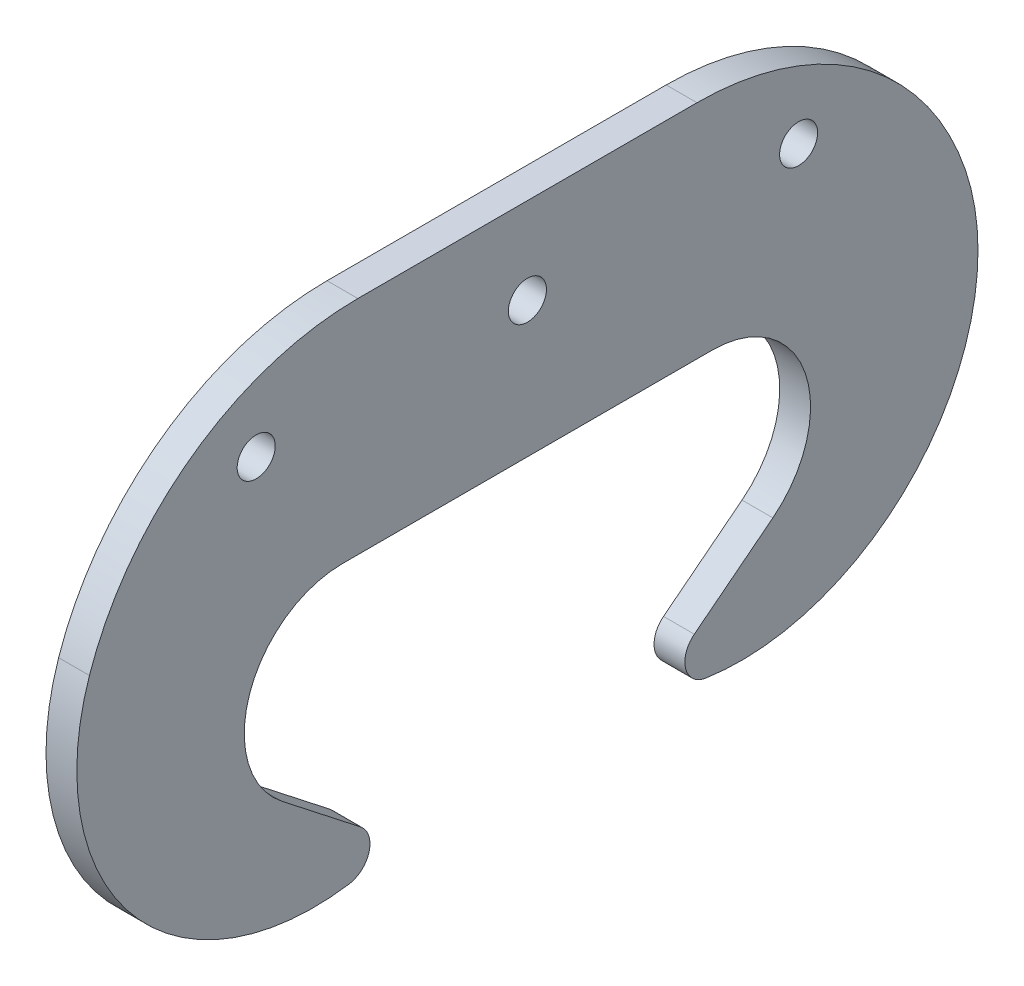
ISO-10303-21;
HEADER;
FILE_DESCRIPTION(('STEP AP214'),'2;1');
FILE_NAME('part.step','',(''),(''),'','','');
FILE_SCHEMA(('AUTOMOTIVE_DESIGN { 1 0 10303 214 1 1 1 1 }'));
ENDSEC;
DATA;
#1=APPLICATION_CONTEXT('core data for automotive mechanical design processes');
#2=APPLICATION_PROTOCOL_DEFINITION('international standard','automotive_design',2000,#1);
#3=PRODUCT_CONTEXT('',#1,'mechanical');
#4=PRODUCT('Part','Part','',(#3));
#5=PRODUCT_RELATED_PRODUCT_CATEGORY('part','',(#4));
#6=PRODUCT_DEFINITION_FORMATION('','',#4);
#7=PRODUCT_DEFINITION_CONTEXT('part definition',#1,'design');
#8=PRODUCT_DEFINITION('design','',#6,#7);
#9=PRODUCT_DEFINITION_SHAPE('','',#8);
#10=(LENGTH_UNIT() NAMED_UNIT(*) SI_UNIT(.MILLI.,.METRE.));
#11=(NAMED_UNIT(*) PLANE_ANGLE_UNIT() SI_UNIT($,.RADIAN.));
#12=(NAMED_UNIT(*) SI_UNIT($,.STERADIAN.) SOLID_ANGLE_UNIT());
#13=UNCERTAINTY_MEASURE_WITH_UNIT(LENGTH_MEASURE(1.E-05),#10,'distance_accuracy_value','');
#14=(GEOMETRIC_REPRESENTATION_CONTEXT(3) GLOBAL_UNCERTAINTY_ASSIGNED_CONTEXT((#13)) GLOBAL_UNIT_ASSIGNED_CONTEXT((#10,
#11,#12)) REPRESENTATION_CONTEXT('',''));
#15=CARTESIAN_POINT('',(0.,0.,0.));
#16=DIRECTION('',(0.,0.,1.));
#17=DIRECTION('',(1.,0.,0.));
#18=AXIS2_PLACEMENT_3D('',#15,#16,#17);
#19=CARTESIAN_POINT('',(7.9375,0.,0.));
#20=DIRECTION('',(1.,0.,0.));
#21=DIRECTION('',(0.,0.,-1.));
#22=AXIS2_PLACEMENT_3D('',#19,#20,#21);
#23=PLANE('',#22);
#24=CARTESIAN_POINT('',(7.9375,30.1625,69.85));
#25=DIRECTION('',(1.,0.,0.));
#26=DIRECTION('',(0.,0.,-1.));
#27=AXIS2_PLACEMENT_3D('',#24,#25,#26);
#28=CIRCLE('',#27,4.90219999999997);
#29=CARTESIAN_POINT('',(7.9375,30.1625,64.9478));
#30=VERTEX_POINT('',#29);
#31=EDGE_CURVE('E212',#30,#30,#28,.T.);
#32=ORIENTED_EDGE('',*,*,#31,.F.);
#33=EDGE_LOOP('',(#32));
#34=FACE_BOUND('',#33,.T.);
#35=CARTESIAN_POINT('',(7.9375,30.1625,0.));
#36=DIRECTION('',(1.,0.,0.));
#37=DIRECTION('',(0.,0.,-1.));
#38=AXIS2_PLACEMENT_3D('',#35,#36,#37);
#39=CIRCLE('',#38,4.90219999999997);
#40=CARTESIAN_POINT('',(7.9375,30.1625,-4.90219999999997));
#41=VERTEX_POINT('',#40);
#42=EDGE_CURVE('E226',#41,#41,#39,.T.);
#43=ORIENTED_EDGE('',*,*,#42,.F.);
#44=EDGE_LOOP('',(#43));
#45=FACE_BOUND('',#44,.T.);
#46=CARTESIAN_POINT('',(7.9375,30.1625,-69.85));
#47=DIRECTION('',(1.,0.,0.));
#48=DIRECTION('',(0.,0.,-1.));
#49=AXIS2_PLACEMENT_3D('',#46,#47,#48);
#50=CIRCLE('',#49,4.90219999999997);
#51=CARTESIAN_POINT('',(7.9375,30.1625,-74.7522));
#52=VERTEX_POINT('',#51);
#53=EDGE_CURVE('E232',#52,#52,#50,.T.);
#54=ORIENTED_EDGE('',*,*,#53,.F.);
#55=EDGE_LOOP('',(#54));
#56=FACE_BOUND('',#55,.T.);
#57=CARTESIAN_POINT('',(7.9375,-16.7692967759258,55.0441756714041));
#58=DIRECTION('',(1.,0.,0.));
#59=DIRECTION('',(0.,0.,-1.));
#60=AXIS2_PLACEMENT_3D('',#57,#58,#59);
#61=CIRCLE('',#60,61.0094261497217);
#62=CARTESIAN_POINT('',(7.9375,2.87161774650495,112.805620908179));
#63=VERTEX_POINT('',#62);
#64=CARTESIAN_POINT('',(7.9375,-77.0978506977302,45.9548599203538));
#65=VERTEX_POINT('',#64);
#66=EDGE_CURVE('E194',#63,#65,#61,.T.);
#67=ORIENTED_EDGE('',*,*,#66,.T.);
#68=CARTESIAN_POINT('',(7.9375,-70.8187174296458,46.9008966012681));
#69=DIRECTION('',(1.,0.,0.));
#70=DIRECTION('',(0.,0.,-1.));
#71=AXIS2_PLACEMENT_3D('',#68,#69,#70);
#72=CIRCLE('',#71,6.35);
#73=CARTESIAN_POINT('',(7.9375,-65.8180606732476,42.9873391397391));
#74=VERTEX_POINT('',#73);
#75=EDGE_CURVE('E275',#65,#74,#72,.T.);
#76=ORIENTED_EDGE('',*,*,#75,.T.);
#77=DIRECTION('',(0.,-0.616308261658114,-0.787505001007583));
#78=VECTOR('',#77,1.);
#79=CARTESIAN_POINT('',(7.9375,-61.6817262602576,48.2726553341151));
#80=LINE('',#79,#78);
#81=CARTESIAN_POINT('',(7.9375,-49.9858306665572,63.2174108149545));
#82=VERTEX_POINT('',#81);
#83=EDGE_CURVE('E239',#82,#74,#80,.T.);
#84=ORIENTED_EDGE('',*,*,#83,.F.);
#85=CARTESIAN_POINT('',(7.9375,-30.0621946252266,47.625));
#86=DIRECTION('',(1.,0.,0.));
#87=DIRECTION('',(0.,0.,1.));
#88=AXIS2_PLACEMENT_3D('',#85,#86,#87);
#89=CIRCLE('',#88,25.2996946252266);
#90=CARTESIAN_POINT('',(7.9375,-4.76250000000002,47.625));
#91=VERTEX_POINT('',#90);
#92=EDGE_CURVE('E203',#91,#82,#89,.T.);
#93=ORIENTED_EDGE('',*,*,#92,.F.);
#94=DIRECTION('',(0.,0.,-1.));
#95=VECTOR('',#94,1.);
#96=CARTESIAN_POINT('',(7.9375,-4.76250000000002,0.));
#97=LINE('',#96,#95);
#98=CARTESIAN_POINT('',(7.9375,-4.76250000000001,-47.625));
#99=VERTEX_POINT('',#98);
#100=EDGE_CURVE('E242',#91,#99,#97,.T.);
#101=ORIENTED_EDGE('',*,*,#100,.T.);
#102=CARTESIAN_POINT('',(7.9375,-30.0621946252266,-47.625));
#103=DIRECTION('',(1.,0.,0.));
#104=DIRECTION('',(0.,0.,-1.));
#105=AXIS2_PLACEMENT_3D('',#102,#103,#104);
#106=CIRCLE('',#105,25.2996946252265);
#107=CARTESIAN_POINT('',(7.9375,-49.9858306665571,-63.2174108149545));
#108=VERTEX_POINT('',#107);
#109=EDGE_CURVE('E215',#108,#99,#106,.T.);
#110=ORIENTED_EDGE('',*,*,#109,.F.);
#111=DIRECTION('',(0.,0.616308261658111,-0.787505001007585));
#112=VECTOR('',#111,1.);
#113=CARTESIAN_POINT('',(7.9375,-61.6817262602579,-48.2726553341149));
#114=LINE('',#113,#112);
#115=CARTESIAN_POINT('',(7.9375,-65.8180606732476,-42.9873391397392));
#116=VERTEX_POINT('',#115);
#117=EDGE_CURVE('E149',#116,#108,#114,.T.);
#118=ORIENTED_EDGE('',*,*,#117,.F.);
#119=CARTESIAN_POINT('',(7.9375,-70.8187174296458,-46.9008966012681));
#120=DIRECTION('',(1.,0.,0.));
#121=DIRECTION('',(0.,0.,-1.));
#122=AXIS2_PLACEMENT_3D('',#119,#120,#121);
#123=CIRCLE('',#122,6.35);
#124=CARTESIAN_POINT('',(7.9375,-77.0978506977302,-45.9548599203538));
#125=VERTEX_POINT('',#124);
#126=EDGE_CURVE('E64',#116,#125,#123,.T.);
#127=ORIENTED_EDGE('',*,*,#126,.T.);
#128=CARTESIAN_POINT('',(7.9375,-16.7692967759258,-55.0441756714041));
#129=DIRECTION('',(1.,0.,0.));
#130=DIRECTION('',(0.,0.,-1.));
#131=AXIS2_PLACEMENT_3D('',#128,#129,#130);
#132=CIRCLE('',#131,61.0094261497217);
#133=CARTESIAN_POINT('',(7.9375,2.87161774650496,-112.805620908179));
#134=VERTEX_POINT('',#133);
#135=EDGE_CURVE('E173',#125,#134,#132,.T.);
#136=ORIENTED_EDGE('',*,*,#135,.T.);
#137=CARTESIAN_POINT('',(7.9375,-20.6375,-43.668279277328));
#138=DIRECTION('',(1.,0.,0.));
#139=DIRECTION('',(0.,0.,-1.));
#140=AXIS2_PLACEMENT_3D('',#137,#138,#139);
#141=CIRCLE('',#140,73.0250000000001);
#142=CARTESIAN_POINT('',(7.93749999999996,52.3875,-43.668279277328));
#143=VERTEX_POINT('',#142);
#144=EDGE_CURVE('E185',#134,#143,#141,.T.);
#145=ORIENTED_EDGE('',*,*,#144,.T.);
#146=DIRECTION('',(0.,0.,-1.));
#147=VECTOR('',#146,1.);
#148=CARTESIAN_POINT('',(7.93749999999993,52.3875,-43.668279277328));
#149=LINE('',#148,#147);
#150=CARTESIAN_POINT('',(7.9375,52.3875,43.668279277328));
#151=VERTEX_POINT('',#150);
#152=EDGE_CURVE('E171',#151,#143,#149,.T.);
#153=ORIENTED_EDGE('',*,*,#152,.F.);
#154=CARTESIAN_POINT('',(7.9375,-20.6375,43.668279277328));
#155=DIRECTION('',(1.,0.,0.));
#156=DIRECTION('',(0.,0.,-1.));
#157=AXIS2_PLACEMENT_3D('',#154,#155,#156);
#158=CIRCLE('',#157,73.0250000000001);
#159=EDGE_CURVE('E157',#151,#63,#158,.T.);
#160=ORIENTED_EDGE('',*,*,#159,.T.);
#161=EDGE_LOOP('',(#67,#76,#84,#93,#101,#110,#118,#127,#136,#145,#153,#160));
#162=FACE_BOUND('',#161,.T.);
#163=ADVANCED_FACE('F49',(#34,#45,#56,#162),#23,.T.);
#164=CARTESIAN_POINT('',(0.,0.,0.));
#165=DIRECTION('',(1.,0.,0.));
#166=DIRECTION('',(0.,0.,-1.));
#167=AXIS2_PLACEMENT_3D('',#164,#165,#166);
#168=PLANE('',#167);
#169=CARTESIAN_POINT('',(0.,30.1625,69.85));
#170=DIRECTION('',(1.,0.,0.));
#171=DIRECTION('',(0.,0.,-1.));
#172=AXIS2_PLACEMENT_3D('',#169,#170,#171);
#173=CIRCLE('',#172,4.9022);
#174=CARTESIAN_POINT('',(0.,30.1625,64.9478));
#175=VERTEX_POINT('',#174);
#176=EDGE_CURVE('E223',#175,#175,#173,.T.);
#177=ORIENTED_EDGE('',*,*,#176,.T.);
#178=EDGE_LOOP('',(#177));
#179=FACE_BOUND('',#178,.T.);
#180=CARTESIAN_POINT('',(0.,30.1625,0.));
#181=DIRECTION('',(1.,0.,0.));
#182=DIRECTION('',(0.,0.,-1.));
#183=AXIS2_PLACEMENT_3D('',#180,#181,#182);
#184=CIRCLE('',#183,4.9022);
#185=CARTESIAN_POINT('',(0.,30.1625,-4.9022));
#186=VERTEX_POINT('',#185);
#187=EDGE_CURVE('E229',#186,#186,#184,.T.);
#188=ORIENTED_EDGE('',*,*,#187,.T.);
#189=EDGE_LOOP('',(#188));
#190=FACE_BOUND('',#189,.T.);
#191=CARTESIAN_POINT('',(0.,30.1625,-69.85));
#192=DIRECTION('',(1.,0.,0.));
#193=DIRECTION('',(0.,0.,-1.));
#194=AXIS2_PLACEMENT_3D('',#191,#192,#193);
#195=CIRCLE('',#194,4.9022);
#196=CARTESIAN_POINT('',(0.,30.1625,-74.7522));
#197=VERTEX_POINT('',#196);
#198=EDGE_CURVE('E235',#197,#197,#195,.T.);
#199=ORIENTED_EDGE('',*,*,#198,.T.);
#200=EDGE_LOOP('',(#199));
#201=FACE_BOUND('',#200,.T.);
#202=DIRECTION('',(0.,-0.616308261658114,-0.787505001007583));
#203=VECTOR('',#202,1.);
#204=CARTESIAN_POINT('',(0.,-61.6817262602576,48.2726553341151));
#205=LINE('',#204,#203);
#206=CARTESIAN_POINT('',(0.,-49.9858306665572,63.2174108149545));
#207=VERTEX_POINT('',#206);
#208=CARTESIAN_POINT('',(0.,-65.8180606732476,42.9873391397391));
#209=VERTEX_POINT('',#208);
#210=EDGE_CURVE('E238',#207,#209,#205,.T.);
#211=ORIENTED_EDGE('',*,*,#210,.T.);
#212=CARTESIAN_POINT('',(0.,-70.8187174296458,46.9008966012681));
#213=DIRECTION('',(1.,0.,0.));
#214=DIRECTION('',(0.,0.,-1.));
#215=AXIS2_PLACEMENT_3D('',#212,#213,#214);
#216=CIRCLE('',#215,6.35);
#217=CARTESIAN_POINT('',(0.,-77.0978506977302,45.9548599203538));
#218=VERTEX_POINT('',#217);
#219=EDGE_CURVE('E179',#209,#218,#216,.F.);
#220=ORIENTED_EDGE('',*,*,#219,.T.);
#221=CARTESIAN_POINT('',(0.,-16.7692967759258,55.0441756714041));
#222=DIRECTION('',(1.,0.,0.));
#223=DIRECTION('',(0.,0.,-1.));
#224=AXIS2_PLACEMENT_3D('',#221,#222,#223);
#225=CIRCLE('',#224,61.0094261497217);
#226=CARTESIAN_POINT('',(0.,2.87161774650495,112.805620908179));
#227=VERTEX_POINT('',#226);
#228=EDGE_CURVE('E163',#227,#218,#225,.T.);
#229=ORIENTED_EDGE('',*,*,#228,.F.);
#230=CARTESIAN_POINT('',(0.,-20.6375,43.668279277328));
#231=DIRECTION('',(1.,0.,0.));
#232=DIRECTION('',(0.,0.,-1.));
#233=AXIS2_PLACEMENT_3D('',#230,#231,#232);
#234=CIRCLE('',#233,73.0250000000001);
#235=CARTESIAN_POINT('',(0.,52.3875,43.668279277328));
#236=VERTEX_POINT('',#235);
#237=EDGE_CURVE('E154',#236,#227,#234,.T.);
#238=ORIENTED_EDGE('',*,*,#237,.F.);
#239=DIRECTION('',(0.,0.,-1.));
#240=VECTOR('',#239,1.);
#241=CARTESIAN_POINT('',(0.,52.3875,0.));
#242=LINE('',#241,#240);
#243=CARTESIAN_POINT('',(0.,52.3875,-43.668279277328));
#244=VERTEX_POINT('',#243);
#245=EDGE_CURVE('E137',#236,#244,#242,.T.);
#246=ORIENTED_EDGE('',*,*,#245,.T.);
#247=CARTESIAN_POINT('',(0.,-20.6375,-43.668279277328));
#248=DIRECTION('',(1.,0.,0.));
#249=DIRECTION('',(0.,0.,-1.));
#250=AXIS2_PLACEMENT_3D('',#247,#248,#249);
#251=CIRCLE('',#250,73.0250000000001);
#252=CARTESIAN_POINT('',(0.,2.87161774650496,-112.805620908179));
#253=VERTEX_POINT('',#252);
#254=EDGE_CURVE('E148',#253,#244,#251,.T.);
#255=ORIENTED_EDGE('',*,*,#254,.F.);
#256=CARTESIAN_POINT('',(0.,-16.7692967759258,-55.0441756714041));
#257=DIRECTION('',(1.,0.,0.));
#258=DIRECTION('',(0.,0.,-1.));
#259=AXIS2_PLACEMENT_3D('',#256,#257,#258);
#260=CIRCLE('',#259,61.0094261497217);
#261=CARTESIAN_POINT('',(0.,-77.0978506977302,-45.9548599203538));
#262=VERTEX_POINT('',#261);
#263=EDGE_CURVE('E165',#262,#253,#260,.T.);
#264=ORIENTED_EDGE('',*,*,#263,.F.);
#265=CARTESIAN_POINT('',(0.,-70.8187174296458,-46.9008966012681));
#266=DIRECTION('',(1.,0.,0.));
#267=DIRECTION('',(0.,0.,-1.));
#268=AXIS2_PLACEMENT_3D('',#265,#266,#267);
#269=CIRCLE('',#268,6.35);
#270=CARTESIAN_POINT('',(0.,-65.8180606732476,-42.9873391397392));
#271=VERTEX_POINT('',#270);
#272=EDGE_CURVE('E177',#262,#271,#269,.F.);
#273=ORIENTED_EDGE('',*,*,#272,.T.);
#274=DIRECTION('',(0.,0.616308261658111,-0.787505001007585));
#275=VECTOR('',#274,1.);
#276=CARTESIAN_POINT('',(0.,-61.6817262602579,-48.2726553341149));
#277=LINE('',#276,#275);
#278=CARTESIAN_POINT('',(0.,-49.9858306665571,-63.2174108149545));
#279=VERTEX_POINT('',#278);
#280=EDGE_CURVE('E243',#271,#279,#277,.T.);
#281=ORIENTED_EDGE('',*,*,#280,.T.);
#282=CARTESIAN_POINT('',(0.,-30.0621946252266,-47.625));
#283=DIRECTION('',(1.,0.,0.));
#284=DIRECTION('',(0.,0.,-1.));
#285=AXIS2_PLACEMENT_3D('',#282,#283,#284);
#286=CIRCLE('',#285,25.2996946252265);
#287=CARTESIAN_POINT('',(0.,-4.76250000000001,-47.625));
#288=VERTEX_POINT('',#287);
#289=EDGE_CURVE('E208',#288,#279,#286,.F.);
#290=ORIENTED_EDGE('',*,*,#289,.F.);
#291=DIRECTION('',(0.,0.,-1.));
#292=VECTOR('',#291,1.);
#293=CARTESIAN_POINT('',(0.,-4.76250000000002,0.));
#294=LINE('',#293,#292);
#295=CARTESIAN_POINT('',(0.,-4.76250000000002,47.625));
#296=VERTEX_POINT('',#295);
#297=EDGE_CURVE('E248',#296,#288,#294,.T.);
#298=ORIENTED_EDGE('',*,*,#297,.F.);
#299=CARTESIAN_POINT('',(0.,-30.0621946252266,47.625));
#300=DIRECTION('',(1.,0.,0.));
#301=DIRECTION('',(0.,0.,-1.));
#302=AXIS2_PLACEMENT_3D('',#299,#300,#301);
#303=CIRCLE('',#302,25.2996946252266);
#304=EDGE_CURVE('E206',#207,#296,#303,.F.);
#305=ORIENTED_EDGE('',*,*,#304,.F.);
#306=EDGE_LOOP('',(#211,#220,#229,#238,#246,#255,#264,#273,#281,#290,#298,#305));
#307=FACE_BOUND('',#306,.T.);
#308=ADVANCED_FACE('F161',(#179,#190,#201,#307),#168,.F.);
#309=CARTESIAN_POINT('',(7.9375,-4.76250000000002,0.));
#310=DIRECTION('',(0.,1.,0.));
#311=DIRECTION('',(0.,0.,1.));
#312=AXIS2_PLACEMENT_3D('',#309,#310,#311);
#313=PLANE('',#312);
#314=DIRECTION('',(1.,0.,0.));
#315=VECTOR('',#314,1.);
#316=CARTESIAN_POINT('',(-174.839804893015,-4.76250000000002,47.625));
#317=LINE('',#316,#315);
#318=EDGE_CURVE('E217',#296,#91,#317,.T.);
#319=ORIENTED_EDGE('',*,*,#318,.F.);
#320=ORIENTED_EDGE('',*,*,#297,.T.);
#321=DIRECTION('',(1.,0.,0.));
#322=VECTOR('',#321,1.);
#323=CARTESIAN_POINT('',(-174.839804893015,-4.76250000000001,-47.625));
#324=LINE('',#323,#322);
#325=EDGE_CURVE('E209',#288,#99,#324,.T.);
#326=ORIENTED_EDGE('',*,*,#325,.T.);
#327=ORIENTED_EDGE('',*,*,#100,.F.);
#328=EDGE_LOOP('',(#319,#320,#326,#327));
#329=FACE_BOUND('',#328,.T.);
#330=ADVANCED_FACE('F263',(#329),#313,.F.);
#331=CARTESIAN_POINT('',(7.9375,-61.6817262602576,48.2726553341151));
#332=DIRECTION('',(0.,0.787505001007583,-0.616308261658114));
#333=DIRECTION('',(0.,0.616308261658114,0.787505001007583));
#334=AXIS2_PLACEMENT_3D('',#331,#332,#333);
#335=PLANE('',#334);
#336=ORIENTED_EDGE('',*,*,#83,.T.);
#337=DIRECTION('',(-1.,0.,0.));
#338=VECTOR('',#337,1.);
#339=CARTESIAN_POINT('',(7.9375,-65.8180606732476,42.9873391397391));
#340=LINE('',#339,#338);
#341=EDGE_CURVE('E170',#74,#209,#340,.T.);
#342=ORIENTED_EDGE('',*,*,#341,.T.);
#343=ORIENTED_EDGE('',*,*,#210,.F.);
#344=DIRECTION('',(1.,0.,0.));
#345=VECTOR('',#344,1.);
#346=CARTESIAN_POINT('',(-0.000999999999999265,-49.9858306665572,63.2174108149545));
#347=LINE('',#346,#345);
#348=EDGE_CURVE('E197',#207,#82,#347,.T.);
#349=ORIENTED_EDGE('',*,*,#348,.T.);
#350=EDGE_LOOP('',(#336,#342,#343,#349));
#351=FACE_BOUND('',#350,.T.);
#352=ADVANCED_FACE('F269',(#351),#335,.T.);
#353=CARTESIAN_POINT('',(7.9375,-61.6817262602579,-48.2726553341149));
#354=DIRECTION('',(0.,0.787505001007585,0.616308261658111));
#355=DIRECTION('',(0.,-0.616308261658111,0.787505001007585));
#356=AXIS2_PLACEMENT_3D('',#353,#354,#355);
#357=PLANE('',#356);
#358=ORIENTED_EDGE('',*,*,#280,.F.);
#359=DIRECTION('',(-1.,0.,0.));
#360=VECTOR('',#359,1.);
#361=CARTESIAN_POINT('',(7.9375,-65.8180606732476,-42.9873391397392));
#362=LINE('',#361,#360);
#363=EDGE_CURVE('E11',#271,#116,#362,.F.);
#364=ORIENTED_EDGE('',*,*,#363,.T.);
#365=ORIENTED_EDGE('',*,*,#117,.T.);
#366=DIRECTION('',(1.,0.,0.));
#367=VECTOR('',#366,1.);
#368=CARTESIAN_POINT('',(-0.000999999999999265,-49.9858306665571,-63.2174108149545));
#369=LINE('',#368,#367);
#370=EDGE_CURVE('E200',#279,#108,#369,.T.);
#371=ORIENTED_EDGE('',*,*,#370,.F.);
#372=EDGE_LOOP('',(#358,#364,#365,#371));
#373=FACE_BOUND('',#372,.T.);
#374=ADVANCED_FACE('F257',(#373),#357,.T.);
#375=CARTESIAN_POINT('',(7.9375,30.1625,-69.85));
#376=DIRECTION('',(1.,0.,0.));
#377=DIRECTION('',(0.,0.,-1.));
#378=AXIS2_PLACEMENT_3D('',#375,#376,#377);
#379=CYLINDRICAL_SURFACE('',#378,4.90219999999998);
#380=ORIENTED_EDGE('',*,*,#198,.F.);
#381=EDGE_LOOP('',(#380));
#382=FACE_BOUND('',#381,.T.);
#383=ORIENTED_EDGE('',*,*,#53,.T.);
#384=EDGE_LOOP('',(#383));
#385=FACE_BOUND('',#384,.T.);
#386=ADVANCED_FACE('F304',(#382,#385),#379,.F.);
#387=CARTESIAN_POINT('',(7.9375,30.1625,0.));
#388=DIRECTION('',(1.,0.,0.));
#389=DIRECTION('',(0.,0.,-1.));
#390=AXIS2_PLACEMENT_3D('',#387,#388,#389);
#391=CYLINDRICAL_SURFACE('',#390,4.90219999999998);
#392=ORIENTED_EDGE('',*,*,#187,.F.);
#393=EDGE_LOOP('',(#392));
#394=FACE_BOUND('',#393,.T.);
#395=ORIENTED_EDGE('',*,*,#42,.T.);
#396=EDGE_LOOP('',(#395));
#397=FACE_BOUND('',#396,.T.);
#398=ADVANCED_FACE('F393',(#394,#397),#391,.F.);
#399=CARTESIAN_POINT('',(7.9375,30.1625,69.85));
#400=DIRECTION('',(1.,0.,0.));
#401=DIRECTION('',(0.,0.,-1.));
#402=AXIS2_PLACEMENT_3D('',#399,#400,#401);
#403=CYLINDRICAL_SURFACE('',#402,4.90219999999998);
#404=ORIENTED_EDGE('',*,*,#176,.F.);
#405=EDGE_LOOP('',(#404));
#406=FACE_BOUND('',#405,.T.);
#407=ORIENTED_EDGE('',*,*,#31,.T.);
#408=EDGE_LOOP('',(#407));
#409=FACE_BOUND('',#408,.T.);
#410=ADVANCED_FACE('F389',(#406,#409),#403,.F.);
#411=CARTESIAN_POINT('',(-174.839804893015,-30.0621946252266,-47.625));
#412=DIRECTION('',(1.,0.,0.));
#413=DIRECTION('',(0.,0.,-1.));
#414=AXIS2_PLACEMENT_3D('',#411,#412,#413);
#415=CYLINDRICAL_SURFACE('',#414,25.2996946252265);
#416=ORIENTED_EDGE('',*,*,#289,.T.);
#417=ORIENTED_EDGE('',*,*,#370,.T.);
#418=ORIENTED_EDGE('',*,*,#109,.T.);
#419=ORIENTED_EDGE('',*,*,#325,.F.);
#420=EDGE_LOOP('',(#416,#417,#418,#419));
#421=FACE_BOUND('',#420,.T.);
#422=ADVANCED_FACE('F256',(#421),#415,.F.);
#423=CARTESIAN_POINT('',(-174.839804893015,-30.0621946252266,47.625));
#424=DIRECTION('',(1.,0.,0.));
#425=DIRECTION('',(0.,0.,-1.));
#426=AXIS2_PLACEMENT_3D('',#423,#424,#425);
#427=CYLINDRICAL_SURFACE('',#426,25.2996946252266);
#428=ORIENTED_EDGE('',*,*,#92,.T.);
#429=ORIENTED_EDGE('',*,*,#348,.F.);
#430=ORIENTED_EDGE('',*,*,#304,.T.);
#431=ORIENTED_EDGE('',*,*,#318,.T.);
#432=EDGE_LOOP('',(#428,#429,#430,#431));
#433=FACE_BOUND('',#432,.T.);
#434=ADVANCED_FACE('F267',(#433),#427,.F.);
#435=CARTESIAN_POINT('',(7.937512,-16.7692967759258,55.0441756714041));
#436=DIRECTION('',(-1.,0.,0.));
#437=DIRECTION('',(0.,0.,1.));
#438=AXIS2_PLACEMENT_3D('',#435,#436,#437);
#439=CYLINDRICAL_SURFACE('',#438,61.0094261497217);
#440=ORIENTED_EDGE('',*,*,#228,.T.);
#441=DIRECTION('',(-1.,0.,0.));
#442=VECTOR('',#441,1.);
#443=CARTESIAN_POINT('',(7.937512,-77.0978506977302,45.9548599203538));
#444=LINE('',#443,#442);
#445=EDGE_CURVE('E181',#218,#65,#444,.F.);
#446=ORIENTED_EDGE('',*,*,#445,.T.);
#447=ORIENTED_EDGE('',*,*,#66,.F.);
#448=DIRECTION('',(-1.,0.,0.));
#449=VECTOR('',#448,1.);
#450=CARTESIAN_POINT('',(7.937512,2.87161774650495,112.805620908179));
#451=LINE('',#450,#449);
#452=EDGE_CURVE('E174',#63,#227,#451,.T.);
#453=ORIENTED_EDGE('',*,*,#452,.T.);
#454=EDGE_LOOP('',(#440,#446,#447,#453));
#455=FACE_BOUND('',#454,.T.);
#456=ADVANCED_FACE('F277',(#455),#439,.T.);
#457=CARTESIAN_POINT('',(7.937512,-20.6375,43.668279277328));
#458=DIRECTION('',(-1.,0.,0.));
#459=DIRECTION('',(0.,0.,1.));
#460=AXIS2_PLACEMENT_3D('',#457,#458,#459);
#461=CYLINDRICAL_SURFACE('',#460,73.0250000000001);
#462=DIRECTION('',(1.,0.,0.));
#463=VECTOR('',#462,1.);
#464=CARTESIAN_POINT('',(-144.4625,52.3875000000001,43.668279277328));
#465=LINE('',#464,#463);
#466=EDGE_CURVE('E141',#236,#151,#465,.T.);
#467=ORIENTED_EDGE('',*,*,#466,.F.);
#468=ORIENTED_EDGE('',*,*,#237,.T.);
#469=ORIENTED_EDGE('',*,*,#452,.F.);
#470=ORIENTED_EDGE('',*,*,#159,.F.);
#471=EDGE_LOOP('',(#467,#468,#469,#470));
#472=FACE_BOUND('',#471,.T.);
#473=ADVANCED_FACE('F152',(#472),#461,.T.);
#474=CARTESIAN_POINT('',(7.937512,-20.6375,-43.668279277328));
#475=DIRECTION('',(-1.,0.,0.));
#476=DIRECTION('',(0.,0.,1.));
#477=AXIS2_PLACEMENT_3D('',#474,#475,#476);
#478=CYLINDRICAL_SURFACE('',#477,73.0250000000001);
#479=DIRECTION('',(-1.,0.,0.));
#480=VECTOR('',#479,1.);
#481=CARTESIAN_POINT('',(7.937512,2.87161774650496,-112.805620908179));
#482=LINE('',#481,#480);
#483=EDGE_CURVE('E278',#134,#253,#482,.T.);
#484=ORIENTED_EDGE('',*,*,#483,.T.);
#485=ORIENTED_EDGE('',*,*,#254,.T.);
#486=DIRECTION('',(1.,0.,0.));
#487=VECTOR('',#486,1.);
#488=CARTESIAN_POINT('',(-144.4625,52.3875,-43.668279277328));
#489=LINE('',#488,#487);
#490=EDGE_CURVE('E143',#244,#143,#489,.T.);
#491=ORIENTED_EDGE('',*,*,#490,.T.);
#492=ORIENTED_EDGE('',*,*,#144,.F.);
#493=EDGE_LOOP('',(#484,#485,#491,#492));
#494=FACE_BOUND('',#493,.T.);
#495=ADVANCED_FACE('F284',(#494),#478,.T.);
#496=CARTESIAN_POINT('',(7.937512,-16.7692967759258,-55.0441756714041));
#497=DIRECTION('',(-1.,0.,0.));
#498=DIRECTION('',(0.,0.,1.));
#499=AXIS2_PLACEMENT_3D('',#496,#497,#498);
#500=CYLINDRICAL_SURFACE('',#499,61.0094261497217);
#501=ORIENTED_EDGE('',*,*,#135,.F.);
#502=DIRECTION('',(-1.,0.,0.));
#503=VECTOR('',#502,1.);
#504=CARTESIAN_POINT('',(7.937512,-77.0978506977302,-45.9548599203538));
#505=LINE('',#504,#503);
#506=EDGE_CURVE('E57',#125,#262,#505,.T.);
#507=ORIENTED_EDGE('',*,*,#506,.T.);
#508=ORIENTED_EDGE('',*,*,#263,.T.);
#509=ORIENTED_EDGE('',*,*,#483,.F.);
#510=EDGE_LOOP('',(#501,#507,#508,#509));
#511=FACE_BOUND('',#510,.T.);
#512=ADVANCED_FACE('F288',(#511),#500,.T.);
#513=CARTESIAN_POINT('',(-144.4625,52.3875,-43.668279277328));
#514=DIRECTION('',(0.,-1.,0.));
#515=DIRECTION('',(0.,0.,-1.));
#516=AXIS2_PLACEMENT_3D('',#513,#514,#515);
#517=PLANE('',#516);
#518=ORIENTED_EDGE('',*,*,#152,.T.);
#519=ORIENTED_EDGE('',*,*,#490,.F.);
#520=ORIENTED_EDGE('',*,*,#245,.F.);
#521=ORIENTED_EDGE('',*,*,#466,.T.);
#522=EDGE_LOOP('',(#518,#519,#520,#521));
#523=FACE_BOUND('',#522,.T.);
#524=ADVANCED_FACE('F140',(#523),#517,.F.);
#525=CARTESIAN_POINT('',(7.937512,-70.8187174296458,46.9008966012681));
#526=DIRECTION('',(-1.,0.,0.));
#527=DIRECTION('',(0.,0.,1.));
#528=AXIS2_PLACEMENT_3D('',#525,#526,#527);
#529=CYLINDRICAL_SURFACE('',#528,6.35);
#530=ORIENTED_EDGE('',*,*,#75,.F.);
#531=ORIENTED_EDGE('',*,*,#445,.F.);
#532=ORIENTED_EDGE('',*,*,#219,.F.);
#533=ORIENTED_EDGE('',*,*,#341,.F.);
#534=EDGE_LOOP('',(#530,#531,#532,#533));
#535=FACE_BOUND('',#534,.T.);
#536=ADVANCED_FACE('F273',(#535),#529,.T.);
#537=CARTESIAN_POINT('',(7.937512,-70.8187174296458,-46.9008966012681));
#538=DIRECTION('',(-1.,0.,0.));
#539=DIRECTION('',(0.,0.,1.));
#540=AXIS2_PLACEMENT_3D('',#537,#538,#539);
#541=CYLINDRICAL_SURFACE('',#540,6.35);
#542=ORIENTED_EDGE('',*,*,#126,.F.);
#543=ORIENTED_EDGE('',*,*,#363,.F.);
#544=ORIENTED_EDGE('',*,*,#272,.F.);
#545=ORIENTED_EDGE('',*,*,#506,.F.);
#546=EDGE_LOOP('',(#542,#543,#544,#545));
#547=FACE_BOUND('',#546,.T.);
#548=ADVANCED_FACE('F51',(#547),#541,.T.);
#549=CLOSED_SHELL('',(#163,#308,#330,#352,#374,#386,#398,#410,#422,#434,#456,#473,#495,#512,
#524,#536,#548));
#550=MANIFOLD_SOLID_BREP('B2',#549);
#551=ADVANCED_BREP_SHAPE_REPRESENTATION('',(#18,#550),#14);
#552=SHAPE_DEFINITION_REPRESENTATION(#9,#551);
ENDSEC;
END-ISO-10303-21;
